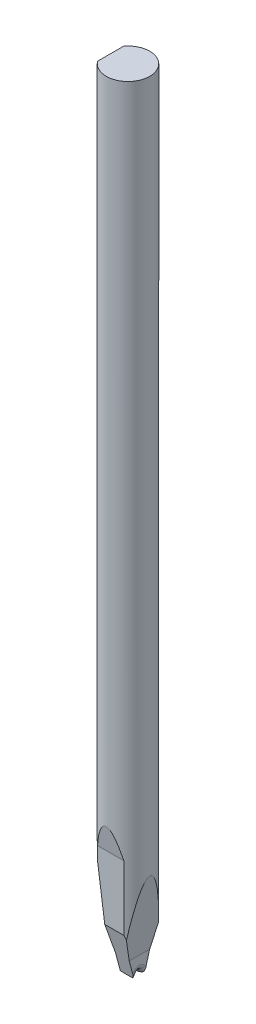
ISO-10303-21;
HEADER;
FILE_DESCRIPTION(('STEP AP214'),'2;1');
FILE_NAME('part.step','',(''),(''),'','','');
FILE_SCHEMA(('AUTOMOTIVE_DESIGN { 1 0 10303 214 1 1 1 1 }'));
ENDSEC;
DATA;
#1=APPLICATION_CONTEXT('core data for automotive mechanical design processes');
#2=APPLICATION_PROTOCOL_DEFINITION('international standard','automotive_design',2000,#1);
#3=PRODUCT_CONTEXT('',#1,'mechanical');
#4=PRODUCT('Part','Part','',(#3));
#5=PRODUCT_RELATED_PRODUCT_CATEGORY('part','',(#4));
#6=PRODUCT_DEFINITION_FORMATION('','',#4);
#7=PRODUCT_DEFINITION_CONTEXT('part definition',#1,'design');
#8=PRODUCT_DEFINITION('design','',#6,#7);
#9=PRODUCT_DEFINITION_SHAPE('','',#8);
#10=(LENGTH_UNIT() NAMED_UNIT(*) SI_UNIT(.MILLI.,.METRE.));
#11=(NAMED_UNIT(*) PLANE_ANGLE_UNIT() SI_UNIT($,.RADIAN.));
#12=(NAMED_UNIT(*) SI_UNIT($,.STERADIAN.) SOLID_ANGLE_UNIT());
#13=UNCERTAINTY_MEASURE_WITH_UNIT(LENGTH_MEASURE(1.E-05),#10,'distance_accuracy_value','');
#14=(GEOMETRIC_REPRESENTATION_CONTEXT(3) GLOBAL_UNCERTAINTY_ASSIGNED_CONTEXT((#13)) GLOBAL_UNIT_ASSIGNED_CONTEXT((#10,
#11,#12)) REPRESENTATION_CONTEXT('',''));
#15=CARTESIAN_POINT('',(0.,0.,0.));
#16=DIRECTION('',(0.,0.,1.));
#17=DIRECTION('',(1.,0.,0.));
#18=AXIS2_PLACEMENT_3D('',#15,#16,#17);
#19=CARTESIAN_POINT('',(0.,0.,0.));
#20=DIRECTION('',(0.,1.,0.));
#21=DIRECTION('',(0.,0.,1.));
#22=AXIS2_PLACEMENT_3D('',#19,#20,#21);
#23=PLANE('',#22);
#24=DIRECTION('',(-1.,0.,0.));
#25=VECTOR('',#24,1.);
#26=CARTESIAN_POINT('',(2.00770998,0.,-0.50038));
#27=LINE('',#26,#25);
#28=CARTESIAN_POINT('',(0.9359796221434,0.,-0.50038));
#29=VERTEX_POINT('',#28);
#30=CARTESIAN_POINT('',(-0.193625916812148,0.,-0.50038));
#31=VERTEX_POINT('',#30);
#32=EDGE_CURVE('E241',#29,#31,#27,.T.);
#33=ORIENTED_EDGE('',*,*,#32,.F.);
#34=CARTESIAN_POINT('',(0.54737,0.,-0.885190740972346));
#35=DIRECTION('',(0.,1.,0.));
#36=DIRECTION('',(0.,0.,-1.));
#37=AXIS2_PLACEMENT_3D('',#34,#35,#36);
#38=ELLIPSE('',#37,0.610851188724457,0.50038);
#39=CARTESIAN_POINT('',(0.54737,0.,-0.274339552247889));
#40=VERTEX_POINT('',#39);
#41=EDGE_CURVE('E413',#29,#40,#38,.F.);
#42=ORIENTED_EDGE('',*,*,#41,.T.);
#43=CARTESIAN_POINT('',(0.54737,0.,-0.274339552247889));
#44=DIRECTION('',(-1.,0.,0.));
#45=VECTOR('',#44,1.);
#46=LINE('',#43,#45);
#47=CARTESIAN_POINT('',(0.0469900000000003,0.,-0.274339552247889));
#48=VERTEX_POINT('',#47);
#49=EDGE_CURVE('E462',#40,#48,#46,.T.);
#50=ORIENTED_EDGE('',*,*,#49,.T.);
#51=CARTESIAN_POINT('',(0.0469900000000003,0.,-0.578214762882391));
#52=DIRECTION('',(0.,1.,0.));
#53=DIRECTION('',(0.,0.,1.));
#54=AXIS2_PLACEMENT_3D('',#51,#52,#53);
#55=ELLIPSE('',#54,0.303875210634501,0.24892);
#56=EDGE_CURVE('E416',#48,#31,#55,.F.);
#57=ORIENTED_EDGE('',*,*,#56,.T.);
#58=EDGE_LOOP('',(#33,#42,#50,#57));
#59=FACE_BOUND('',#58,.T.);
#60=ADVANCED_FACE('F41',(#59),#23,.F.);
#61=CARTESIAN_POINT('',(0.,71.99884,0.));
#62=DIRECTION('',(0.,-1.,0.));
#63=DIRECTION('',(0.,0.,-1.));
#64=AXIS2_PLACEMENT_3D('',#61,#62,#63);
#65=CYLINDRICAL_SURFACE('',#64,1.99771);
#66=CARTESIAN_POINT('',(0.,0.188793391958972,0.));
#67=DIRECTION('',(-0.99026806874157,-0.139173100960066,0.));
#68=DIRECTION('',(0.139173100960066,-0.99026806874157,0.));
#69=AXIS2_PLACEMENT_3D('',#66,#67,#68);
#70=ELLIPSE('',#69,14.3541387395918,1.99771);
#71=CARTESIAN_POINT('',(-1.20938746582723,8.79403234893694,1.59004));
#72=VERTEX_POINT('',#71);
#73=CARTESIAN_POINT('',(-1.60147,11.5838445412656,1.19421065277446));
#74=VERTEX_POINT('',#73);
#75=EDGE_CURVE('E251',#72,#74,#70,.T.);
#76=ORIENTED_EDGE('',*,*,#75,.F.);
#77=DIRECTION('',(0.,-1.,0.));
#78=VECTOR('',#77,1.);
#79=CARTESIAN_POINT('',(-1.20938746582723,71.99884,1.59004));
#80=LINE('',#79,#78);
#81=CARTESIAN_POINT('',(-1.20938746582723,9.98537787946442,1.59004));
#82=VERTEX_POINT('',#81);
#83=EDGE_CURVE('E213',#82,#72,#80,.T.);
#84=ORIENTED_EDGE('',*,*,#83,.F.);
#85=CARTESIAN_POINT('',(-1.20429720645774,10.0294845165918,1.5938988307349));
#86=CARTESIAN_POINT('',(-1.20598336450717,10.0222855201269,1.59262220181167));
#87=CARTESIAN_POINT('',(-1.20725063181282,10.0150104686973,1.59166231812201));
#88=CARTESIAN_POINT('',(-1.20894738488989,10.0003082563132,1.59037604124523));
#89=CARTESIAN_POINT('',(-1.2093768707074,9.99288109536695,1.59004964802325));
#90=CARTESIAN_POINT('',(-1.20938746582723,9.98537787946442,1.59004));
#91=B_SPLINE_CURVE_WITH_KNOTS('',3,(#85,#86,#87,#88,#89,#90),.UNSPECIFIED.,.F.,.F.,(4,2,4),(0.,
0.022340175644429,0.0446803500598758),.UNSPECIFIED.);
#92=CARTESIAN_POINT('',(-1.20429720645774,10.0294845165918,1.5938988307349));
#93=VERTEX_POINT('',#92);
#94=EDGE_CURVE('E305',#93,#82,#91,.T.);
#95=ORIENTED_EDGE('',*,*,#94,.F.);
#96=CARTESIAN_POINT('',(0.,0.990035055535105,0.));
#97=DIRECTION('',(0.,-0.173648177666931,0.984807753012208));
#98=DIRECTION('',(0.,-0.984807753012208,-0.173648177666931));
#99=AXIS2_PLACEMENT_3D('',#96,#97,#98);
#100=ELLIPSE('',#99,11.5043533818808,1.99771);
#101=CARTESIAN_POINT('',(1.20429720645774,10.0294845165918,1.5938988307349));
#102=VERTEX_POINT('',#101);
#103=EDGE_CURVE('E313',#102,#93,#100,.T.);
#104=ORIENTED_EDGE('',*,*,#103,.F.);
#105=CARTESIAN_POINT('',(1.20938746582723,9.98537787946442,1.59004));
#106=CARTESIAN_POINT('',(1.2093768707074,9.99288109536694,1.59004964802325));
#107=CARTESIAN_POINT('',(1.20894738488989,10.0003082563131,1.59037604124522));
#108=CARTESIAN_POINT('',(1.20725063181282,10.0150104686973,1.59166231812201));
#109=CARTESIAN_POINT('',(1.20598336450717,10.0222855201269,1.59262220181167));
#110=CARTESIAN_POINT('',(1.20429720645774,10.0294845165918,1.5938988307349));
#111=B_SPLINE_CURVE_WITH_KNOTS('',3,(#105,#106,#107,#108,#109,#110),.UNSPECIFIED.,.F.,.F.,(4,2,
4),(0.,0.0223401744154467,0.0446803500598775),.UNSPECIFIED.);
#112=CARTESIAN_POINT('',(1.20938746582723,9.98537787946442,1.59004));
#113=VERTEX_POINT('',#112);
#114=EDGE_CURVE('E274',#113,#102,#111,.T.);
#115=ORIENTED_EDGE('',*,*,#114,.F.);
#116=DIRECTION('',(0.,-1.,0.));
#117=VECTOR('',#116,1.);
#118=CARTESIAN_POINT('',(1.20938746582723,71.99884,1.59004));
#119=LINE('',#118,#117);
#120=CARTESIAN_POINT('',(1.20938746582723,4.06666648297549,1.59004));
#121=VERTEX_POINT('',#120);
#122=EDGE_CURVE('E270',#121,#113,#119,.F.);
#123=ORIENTED_EDGE('',*,*,#122,.F.);
#124=CARTESIAN_POINT('',(0.,-1.86744358309131,0.));
#125=DIRECTION('',(0.,-0.258819045102522,0.965925826289068));
#126=DIRECTION('',(0.,-0.965925826289068,-0.258819045102522));
#127=AXIS2_PLACEMENT_3D('',#124,#125,#126);
#128=ELLIPSE('',#127,7.71855872974372,1.99771);
#129=CARTESIAN_POINT('',(1.33590035902096,3.67589634007195,1.4853334557828));
#130=VERTEX_POINT('',#129);
#131=EDGE_CURVE('E202',#130,#121,#128,.T.);
#132=ORIENTED_EDGE('',*,*,#131,.F.);
#133=CARTESIAN_POINT('',(0.,-5.82952862662844,0.));
#134=DIRECTION('',(0.990268068741571,-0.139173100960058,0.));
#135=DIRECTION('',(-0.139173100960058,-0.990268068741571,0.));
#136=AXIS2_PLACEMENT_3D('',#133,#134,#135);
#137=ELLIPSE('',#136,14.3541387395926,1.99771);
#138=CARTESIAN_POINT('',(1.33590035902096,3.67589634007195,-1.4853334557828));
#139=VERTEX_POINT('',#138);
#140=EDGE_CURVE('E268',#139,#130,#137,.T.);
#141=ORIENTED_EDGE('',*,*,#140,.F.);
#142=CARTESIAN_POINT('',(0.,-1.86744358309131,0.));
#143=DIRECTION('',(0.,-0.258819045102522,-0.965925826289068));
#144=DIRECTION('',(0.,-0.965925826289068,0.258819045102522));
#145=AXIS2_PLACEMENT_3D('',#142,#143,#144);
#146=ELLIPSE('',#145,7.71855872974372,1.99771);
#147=CARTESIAN_POINT('',(1.20938746582723,4.06666648297549,-1.59004));
#148=VERTEX_POINT('',#147);
#149=EDGE_CURVE('E252',#148,#139,#146,.T.);
#150=ORIENTED_EDGE('',*,*,#149,.F.);
#151=DIRECTION('',(0.,-1.,0.));
#152=VECTOR('',#151,1.);
#153=CARTESIAN_POINT('',(1.20938746582723,71.99884,-1.59004));
#154=LINE('',#153,#152);
#155=CARTESIAN_POINT('',(1.20938746582723,9.98537787946442,-1.59004));
#156=VERTEX_POINT('',#155);
#157=EDGE_CURVE('E272',#156,#148,#154,.T.);
#158=ORIENTED_EDGE('',*,*,#157,.F.);
#159=CARTESIAN_POINT('',(1.20429720645774,10.0294845165918,-1.5938988307349));
#160=CARTESIAN_POINT('',(1.20598336450717,10.0222855201269,-1.59262220181167));
#161=CARTESIAN_POINT('',(1.20725063181282,10.0150104686973,-1.59166231812201));
#162=CARTESIAN_POINT('',(1.20894738488989,10.0003082563132,-1.59037604124523));
#163=CARTESIAN_POINT('',(1.2093768707074,9.99288109536695,-1.59004964802325));
#164=CARTESIAN_POINT('',(1.20938746582723,9.98537787946442,-1.59004));
#165=B_SPLINE_CURVE_WITH_KNOTS('',3,(#159,#160,#161,#162,#163,#164),.UNSPECIFIED.,.F.,.F.,(4,2,
4),(0.,0.022340175644429,0.0446803500598758),.UNSPECIFIED.);
#166=CARTESIAN_POINT('',(1.20429720645774,10.0294845165918,-1.5938988307349));
#167=VERTEX_POINT('',#166);
#168=EDGE_CURVE('E282',#167,#156,#165,.T.);
#169=ORIENTED_EDGE('',*,*,#168,.F.);
#170=CARTESIAN_POINT('',(0.,0.990035055535105,0.));
#171=DIRECTION('',(0.,-0.173648177666931,-0.984807753012208));
#172=DIRECTION('',(0.,-0.984807753012208,0.173648177666931));
#173=AXIS2_PLACEMENT_3D('',#170,#171,#172);
#174=ELLIPSE('',#173,11.5043533818808,1.99771);
#175=CARTESIAN_POINT('',(-1.20429720645774,10.0294845165918,-1.5938988307349));
#176=VERTEX_POINT('',#175);
#177=EDGE_CURVE('E528',#176,#167,#174,.T.);
#178=ORIENTED_EDGE('',*,*,#177,.F.);
#179=CARTESIAN_POINT('',(-1.20938746582723,9.98537787946442,-1.59004));
#180=CARTESIAN_POINT('',(-1.2093768707074,9.99288109536694,-1.59004964802325));
#181=CARTESIAN_POINT('',(-1.20894738488989,10.0003082563131,-1.59037604124522));
#182=CARTESIAN_POINT('',(-1.20725063181282,10.0150104686973,-1.59166231812201));
#183=CARTESIAN_POINT('',(-1.20598336450717,10.0222855201269,-1.59262220181167));
#184=CARTESIAN_POINT('',(-1.20429720645774,10.0294845165918,-1.5938988307349));
#185=B_SPLINE_CURVE_WITH_KNOTS('',3,(#179,#180,#181,#182,#183,#184),.UNSPECIFIED.,.F.,.F.,(4,2,
4),(0.,0.0223401744154467,0.0446803500598775),.UNSPECIFIED.);
#186=CARTESIAN_POINT('',(-1.20938746582723,9.98537787946442,-1.59004));
#187=VERTEX_POINT('',#186);
#188=EDGE_CURVE('E312',#187,#176,#185,.T.);
#189=ORIENTED_EDGE('',*,*,#188,.F.);
#190=DIRECTION('',(0.,-1.,0.));
#191=VECTOR('',#190,1.);
#192=CARTESIAN_POINT('',(-1.20938746582723,71.99884,-1.59004));
#193=LINE('',#192,#191);
#194=CARTESIAN_POINT('',(-1.20938746582723,8.79403234893694,-1.59004));
#195=VERTEX_POINT('',#194);
#196=EDGE_CURVE('E352',#195,#187,#193,.F.);
#197=ORIENTED_EDGE('',*,*,#196,.F.);
#198=CARTESIAN_POINT('',(-1.60147,11.5838445412656,-1.19421065277446));
#199=VERTEX_POINT('',#198);
#200=EDGE_CURVE('E205',#199,#195,#70,.T.);
#201=ORIENTED_EDGE('',*,*,#200,.F.);
#202=DIRECTION('',(0.,-1.,0.));
#203=VECTOR('',#202,1.);
#204=CARTESIAN_POINT('',(-1.60147,71.99884,-1.19421065277446));
#205=LINE('',#204,#203);
#206=CARTESIAN_POINT('',(-1.60147,71.99884,-1.19421065277446));
#207=VERTEX_POINT('',#206);
#208=EDGE_CURVE('E259',#207,#199,#205,.T.);
#209=ORIENTED_EDGE('',*,*,#208,.F.);
#210=CARTESIAN_POINT('',(0.,71.99884,0.));
#211=DIRECTION('',(0.,1.,0.));
#212=DIRECTION('',(0.,0.,1.));
#213=AXIS2_PLACEMENT_3D('',#210,#211,#212);
#214=CIRCLE('',#213,1.99771);
#215=CARTESIAN_POINT('',(-1.60147,71.99884,1.19421065277446));
#216=VERTEX_POINT('',#215);
#217=EDGE_CURVE('E262',#216,#207,#214,.T.);
#218=ORIENTED_EDGE('',*,*,#217,.F.);
#219=DIRECTION('',(0.,-1.,0.));
#220=VECTOR('',#219,1.);
#221=CARTESIAN_POINT('',(-1.60147,71.99884,1.19421065277446));
#222=LINE('',#221,#220);
#223=EDGE_CURVE('E257',#74,#216,#222,.F.);
#224=ORIENTED_EDGE('',*,*,#223,.F.);
#225=EDGE_LOOP('',(#76,#84,#95,#104,#115,#123,#132,#141,#150,#158,#169,#178,#189,#197,#201,#209,
#218,#224));
#226=FACE_BOUND('',#225,.T.);
#227=ADVANCED_FACE('F289',(#226),#65,.T.);
#228=CARTESIAN_POINT('',(-1.60147,71.99884,2.00770998));
#229=DIRECTION('',(-1.,0.,0.));
#230=DIRECTION('',(0.,0.,1.));
#231=AXIS2_PLACEMENT_3D('',#228,#229,#230);
#232=PLANE('',#231);
#233=ORIENTED_EDGE('',*,*,#208,.T.);
#234=DIRECTION('',(0.,0.,1.));
#235=VECTOR('',#234,1.);
#236=CARTESIAN_POINT('',(-1.60147,11.5838445412656,2.00770998));
#237=LINE('',#236,#235);
#238=EDGE_CURVE('E265',#199,#74,#237,.T.);
#239=ORIENTED_EDGE('',*,*,#238,.T.);
#240=ORIENTED_EDGE('',*,*,#223,.T.);
#241=DIRECTION('',(0.,0.,-1.));
#242=VECTOR('',#241,1.);
#243=CARTESIAN_POINT('',(-1.60147,71.99884,2.00770998));
#244=LINE('',#243,#242);
#245=EDGE_CURVE('E255',#216,#207,#244,.T.);
#246=ORIENTED_EDGE('',*,*,#245,.T.);
#247=EDGE_LOOP('',(#233,#239,#240,#246));
#248=FACE_BOUND('',#247,.T.);
#249=ADVANCED_FACE('F332',(#248),#232,.T.);
#250=CARTESIAN_POINT('',(0.,71.99884,0.));
#251=DIRECTION('',(0.,1.,0.));
#252=DIRECTION('',(0.,0.,1.));
#253=AXIS2_PLACEMENT_3D('',#250,#251,#252);
#254=PLANE('',#253);
#255=ORIENTED_EDGE('',*,*,#217,.T.);
#256=ORIENTED_EDGE('',*,*,#245,.F.);
#257=EDGE_LOOP('',(#255,#256));
#258=FACE_BOUND('',#257,.T.);
#259=ADVANCED_FACE('F335',(#258),#254,.T.);
#260=CARTESIAN_POINT('',(2.00770998,-0.00999998000000006,-1.59004));
#261=DIRECTION('',(0.,0.,-1.));
#262=DIRECTION('',(-1.,0.,0.));
#263=AXIS2_PLACEMENT_3D('',#260,#261,#262);
#264=PLANE('',#263);
#265=ORIENTED_EDGE('',*,*,#157,.T.);
#266=DIRECTION('',(-1.,0.,0.));
#267=VECTOR('',#266,1.);
#268=CARTESIAN_POINT('',(2.00770998,4.06666648297549,-1.59004));
#269=LINE('',#268,#267);
#270=CARTESIAN_POINT('',(-0.544999521081408,4.06666648297549,-1.59004));
#271=VERTEX_POINT('',#270);
#272=EDGE_CURVE('E243',#148,#271,#269,.T.);
#273=ORIENTED_EDGE('',*,*,#272,.T.);
#274=DIRECTION('',(-0.139173100960066,0.99026806874157,0.));
#275=VECTOR('',#274,1.);
#276=CARTESIAN_POINT('',(0.0662850795368128,-0.282849456023105,-1.59004));
#277=LINE('',#276,#275);
#278=EDGE_CURVE('E221',#271,#195,#277,.T.);
#279=ORIENTED_EDGE('',*,*,#278,.T.);
#280=ORIENTED_EDGE('',*,*,#196,.T.);
#281=DIRECTION('',(-1.,0.,0.));
#282=VECTOR('',#281,1.);
#283=CARTESIAN_POINT('',(2.00770998,9.98537787946442,-1.59004));
#284=LINE('',#283,#282);
#285=EDGE_CURVE('E245',#156,#187,#284,.T.);
#286=ORIENTED_EDGE('',*,*,#285,.F.);
#287=EDGE_LOOP('',(#265,#273,#279,#280,#286));
#288=FACE_BOUND('',#287,.T.);
#289=ADVANCED_FACE('F326',(#288),#264,.T.);
#290=CARTESIAN_POINT('',(2.00770998,-0.00999998000000006,1.59004));
#291=DIRECTION('',(0.,0.,1.));
#292=DIRECTION('',(1.,0.,0.));
#293=AXIS2_PLACEMENT_3D('',#290,#291,#292);
#294=PLANE('',#293);
#295=ORIENTED_EDGE('',*,*,#83,.T.);
#296=DIRECTION('',(0.139173100960066,-0.99026806874157,0.));
#297=VECTOR('',#296,1.);
#298=CARTESIAN_POINT('',(0.0662850795368128,-0.282849456023105,1.59004));
#299=LINE('',#298,#297);
#300=CARTESIAN_POINT('',(-0.544999521081408,4.06666648297549,1.59004));
#301=VERTEX_POINT('',#300);
#302=EDGE_CURVE('E209',#72,#301,#299,.T.);
#303=ORIENTED_EDGE('',*,*,#302,.T.);
#304=DIRECTION('',(-1.,0.,0.));
#305=VECTOR('',#304,1.);
#306=CARTESIAN_POINT('',(2.00770998,4.06666648297549,1.59004));
#307=LINE('',#306,#305);
#308=EDGE_CURVE('E193',#121,#301,#307,.T.);
#309=ORIENTED_EDGE('',*,*,#308,.F.);
#310=ORIENTED_EDGE('',*,*,#122,.T.);
#311=DIRECTION('',(-1.,0.,0.));
#312=VECTOR('',#311,1.);
#313=CARTESIAN_POINT('',(2.00770998,9.98537787946442,1.59004));
#314=LINE('',#313,#312);
#315=EDGE_CURVE('E234',#113,#82,#314,.T.);
#316=ORIENTED_EDGE('',*,*,#315,.T.);
#317=EDGE_LOOP('',(#295,#303,#309,#310,#316));
#318=FACE_BOUND('',#317,.T.);
#319=ADVANCED_FACE('F210',(#318),#294,.T.);
#320=CARTESIAN_POINT('',(2.00770998,10.0294845165918,-1.5938988307349));
#321=DIRECTION('',(0.,-0.173648177666931,-0.984807753012208));
#322=DIRECTION('',(0.,0.984807753012208,-0.173648177666931));
#323=AXIS2_PLACEMENT_3D('',#320,#321,#322);
#324=PLANE('',#323);
#325=ORIENTED_EDGE('',*,*,#177,.T.);
#326=DIRECTION('',(-1.,0.,0.));
#327=VECTOR('',#326,1.);
#328=CARTESIAN_POINT('',(2.00770998,10.0294845165918,-1.5938988307349));
#329=LINE('',#328,#327);
#330=EDGE_CURVE('E206',#167,#176,#329,.T.);
#331=ORIENTED_EDGE('',*,*,#330,.T.);
#332=EDGE_LOOP('',(#325,#331));
#333=FACE_BOUND('',#332,.T.);
#334=ADVANCED_FACE('F324',(#333),#324,.T.);
#335=CARTESIAN_POINT('',(2.00770998,9.98537787946442,-1.84404));
#336=DIRECTION('',(-1.,0.,0.));
#337=DIRECTION('',(0.,0.,1.));
#338=AXIS2_PLACEMENT_3D('',#335,#336,#337);
#339=CYLINDRICAL_SURFACE('',#338,0.254);
#340=ORIENTED_EDGE('',*,*,#168,.T.);
#341=ORIENTED_EDGE('',*,*,#285,.T.);
#342=ORIENTED_EDGE('',*,*,#188,.T.);
#343=ORIENTED_EDGE('',*,*,#330,.F.);
#344=EDGE_LOOP('',(#340,#341,#342,#343));
#345=FACE_BOUND('',#344,.T.);
#346=ADVANCED_FACE('F299',(#345),#339,.F.);
#347=CARTESIAN_POINT('',(2.00770998,9.98537787946442,1.84404));
#348=DIRECTION('',(-1.,0.,0.));
#349=DIRECTION('',(0.,0.,1.));
#350=AXIS2_PLACEMENT_3D('',#347,#348,#349);
#351=CYLINDRICAL_SURFACE('',#350,0.254);
#352=ORIENTED_EDGE('',*,*,#114,.T.);
#353=DIRECTION('',(-1.,0.,0.));
#354=VECTOR('',#353,1.);
#355=CARTESIAN_POINT('',(2.00770998,10.0294845165918,1.5938988307349));
#356=LINE('',#355,#354);
#357=EDGE_CURVE('E236',#102,#93,#356,.T.);
#358=ORIENTED_EDGE('',*,*,#357,.T.);
#359=ORIENTED_EDGE('',*,*,#94,.T.);
#360=ORIENTED_EDGE('',*,*,#315,.F.);
#361=EDGE_LOOP('',(#352,#358,#359,#360));
#362=FACE_BOUND('',#361,.T.);
#363=ADVANCED_FACE('F293',(#362),#351,.F.);
#364=CARTESIAN_POINT('',(2.00770998,10.0294845165918,1.5938988307349));
#365=DIRECTION('',(0.,-0.173648177666931,0.984807753012208));
#366=DIRECTION('',(0.,-0.984807753012208,-0.173648177666931));
#367=AXIS2_PLACEMENT_3D('',#364,#365,#366);
#368=PLANE('',#367);
#369=ORIENTED_EDGE('',*,*,#103,.T.);
#370=ORIENTED_EDGE('',*,*,#357,.F.);
#371=EDGE_LOOP('',(#369,#370));
#372=FACE_BOUND('',#371,.T.);
#373=ADVANCED_FACE('F298',(#372),#368,.T.);
#374=CARTESIAN_POINT('',(1.04775,1.6256,2.00770998));
#375=DIRECTION('',(0.990268068741571,-0.139173100960058,0.));
#376=DIRECTION('',(0.139173100960058,0.990268068741571,0.));
#377=AXIS2_PLACEMENT_3D('',#374,#375,#376);
#378=PLANE('',#377);
#379=ORIENTED_EDGE('',*,*,#140,.T.);
#380=DIRECTION('',(0.13451818867903,0.957146646836786,0.256466671058075));
#381=VECTOR('',#380,1.);
#382=CARTESIAN_POINT('',(0.840791506250256,0.15301379978275,0.541379924082605));
#383=LINE('',#382,#381);
#384=CARTESIAN_POINT('',(1.04775,1.6256,0.935958207216034));
#385=VERTEX_POINT('',#384);
#386=EDGE_CURVE('E485',#385,#130,#383,.T.);
#387=ORIENTED_EDGE('',*,*,#386,.F.);
#388=DIRECTION('',(0.,0.,-1.));
#389=VECTOR('',#388,1.);
#390=CARTESIAN_POINT('',(1.04775,1.6256,2.00770998));
#391=LINE('',#390,#389);
#392=CARTESIAN_POINT('',(1.04775,1.6256,-0.935958207216034));
#393=VERTEX_POINT('',#392);
#394=EDGE_CURVE('E480',#385,#393,#391,.T.);
#395=ORIENTED_EDGE('',*,*,#394,.T.);
#396=DIRECTION('',(-0.13451818867903,-0.957146646836786,0.256466671058075));
#397=VECTOR('',#396,1.);
#398=CARTESIAN_POINT('',(0.840791506250256,0.15301379978275,-0.541379924082605));
#399=LINE('',#398,#397);
#400=EDGE_CURVE('E478',#139,#393,#399,.T.);
#401=ORIENTED_EDGE('',*,*,#400,.F.);
#402=EDGE_LOOP('',(#379,#387,#395,#401));
#403=FACE_BOUND('',#402,.T.);
#404=ADVANCED_FACE('F390',(#403),#378,.T.);
#405=CARTESIAN_POINT('',(2.00770998,0.,0.50038));
#406=DIRECTION('',(0.,-0.258819045102522,0.965925826289068));
#407=DIRECTION('',(0.,-0.965925826289068,-0.258819045102522));
#408=AXIS2_PLACEMENT_3D('',#405,#406,#407);
#409=PLANE('',#408);
#410=DIRECTION('',(-1.,0.,0.));
#411=VECTOR('',#410,1.);
#412=CARTESIAN_POINT('',(2.00770998,0.,0.50038));
#413=LINE('',#412,#411);
#414=CARTESIAN_POINT('',(0.9359796221434,0.,0.50038));
#415=VERTEX_POINT('',#414);
#416=CARTESIAN_POINT('',(-0.193625916812148,0.,0.50038));
#417=VERTEX_POINT('',#416);
#418=EDGE_CURVE('E239',#415,#417,#413,.T.);
#419=ORIENTED_EDGE('',*,*,#418,.F.);
#420=CARTESIAN_POINT('',(0.54737,0.397467402532683,0.606881069526329));
#421=DIRECTION('',(0.,-0.258819045102522,0.965925826289068));
#422=DIRECTION('',(0.,0.965925826289068,0.258819045102522));
#423=AXIS2_PLACEMENT_3D('',#420,#421,#422);
#424=ELLIPSE('',#423,0.653199699436086,0.50038);
#425=CARTESIAN_POINT('',(1.04775,0.397467402532683,0.606881069526329));
#426=VERTEX_POINT('',#425);
#427=EDGE_CURVE('E50',#415,#426,#424,.T.);
#428=ORIENTED_EDGE('',*,*,#427,.T.);
#429=DIRECTION('',(0.,0.965925826289068,0.258819045102522));
#430=VECTOR('',#429,1.);
#431=CARTESIAN_POINT('',(1.04775,0.,0.50038));
#432=LINE('',#431,#430);
#433=EDGE_CURVE('E479',#426,#385,#432,.T.);
#434=ORIENTED_EDGE('',*,*,#433,.T.);
#435=ORIENTED_EDGE('',*,*,#386,.T.);
#436=ORIENTED_EDGE('',*,*,#131,.T.);
#437=ORIENTED_EDGE('',*,*,#308,.T.);
#438=DIRECTION('',(0.134518188679037,-0.957146646836785,-0.256466671058074));
#439=VECTOR('',#438,1.);
#440=CARTESIAN_POINT('',(0.062382858549715,-0.255083710961456,0.432030525645544));
#441=LINE('',#440,#439);
#442=CARTESIAN_POINT('',(-0.20193,1.6256,0.935958207216034));
#443=VERTEX_POINT('',#442);
#444=EDGE_CURVE('E198',#301,#443,#441,.T.);
#445=ORIENTED_EDGE('',*,*,#444,.T.);
#446=DIRECTION('',(0.,-0.965925826289068,-0.258819045102522));
#447=VECTOR('',#446,1.);
#448=CARTESIAN_POINT('',(-0.20193,0.,0.50038));
#449=LINE('',#448,#447);
#450=CARTESIAN_POINT('',(-0.20193,0.0803947960273653,0.521921720671197));
#451=VERTEX_POINT('',#450);
#452=EDGE_CURVE('E232',#443,#451,#449,.T.);
#453=ORIENTED_EDGE('',*,*,#452,.T.);
#454=CARTESIAN_POINT('',(0.0469900000000002,0.0803947960273652,0.521921720671197));
#455=DIRECTION('',(0.,-0.258819045102522,0.965925826289068));
#456=DIRECTION('',(0.,-0.965925826289068,-0.258819045102522));
#457=AXIS2_PLACEMENT_3D('',#454,#455,#456);
#458=ELLIPSE('',#457,0.324941982460591,0.24892);
#459=EDGE_CURVE('E491',#451,#417,#458,.T.);
#460=ORIENTED_EDGE('',*,*,#459,.T.);
#461=EDGE_LOOP('',(#419,#428,#434,#435,#436,#437,#445,#453,#460));
#462=FACE_BOUND('',#461,.T.);
#463=ADVANCED_FACE('F195',(#462),#409,.T.);
#464=CARTESIAN_POINT('',(2.00770998,0.,-0.50038));
#465=DIRECTION('',(0.,-0.258819045102522,-0.965925826289068));
#466=DIRECTION('',(0.,0.965925826289068,-0.258819045102522));
#467=AXIS2_PLACEMENT_3D('',#464,#465,#466);
#468=PLANE('',#467);
#469=DIRECTION('',(0.,-0.965925826289068,0.258819045102522));
#470=VECTOR('',#469,1.);
#471=CARTESIAN_POINT('',(1.04775,0.,-0.50038));
#472=LINE('',#471,#470);
#473=CARTESIAN_POINT('',(1.04775,0.397467402532684,-0.606881069526329));
#474=VERTEX_POINT('',#473);
#475=EDGE_CURVE('E475',#393,#474,#472,.T.);
#476=ORIENTED_EDGE('',*,*,#475,.T.);
#477=CARTESIAN_POINT('',(0.54737,0.397467402532683,-0.606881069526329));
#478=DIRECTION('',(0.,-0.258819045102522,-0.965925826289068));
#479=DIRECTION('',(0.,-0.965925826289068,0.258819045102522));
#480=AXIS2_PLACEMENT_3D('',#477,#478,#479);
#481=ELLIPSE('',#480,0.653199699436086,0.50038);
#482=EDGE_CURVE('E424',#474,#29,#481,.T.);
#483=ORIENTED_EDGE('',*,*,#482,.T.);
#484=ORIENTED_EDGE('',*,*,#32,.T.);
#485=CARTESIAN_POINT('',(0.0469900000000003,0.0803947960273654,-0.521921720671197));
#486=DIRECTION('',(0.,-0.258819045102522,-0.965925826289068));
#487=DIRECTION('',(0.,0.965925826289068,-0.258819045102522));
#488=AXIS2_PLACEMENT_3D('',#485,#486,#487);
#489=ELLIPSE('',#488,0.324941982460591,0.24892);
#490=CARTESIAN_POINT('',(-0.20193,0.0803947960273654,-0.521921720671197));
#491=VERTEX_POINT('',#490);
#492=EDGE_CURVE('E458',#31,#491,#489,.T.);
#493=ORIENTED_EDGE('',*,*,#492,.T.);
#494=DIRECTION('',(0.,0.965925826289068,-0.258819045102522));
#495=VECTOR('',#494,1.);
#496=CARTESIAN_POINT('',(-0.20193,0.,-0.50038));
#497=LINE('',#496,#495);
#498=CARTESIAN_POINT('',(-0.20193,1.6256,-0.935958207216034));
#499=VERTEX_POINT('',#498);
#500=EDGE_CURVE('E230',#491,#499,#497,.T.);
#501=ORIENTED_EDGE('',*,*,#500,.T.);
#502=DIRECTION('',(-0.134518188679037,0.957146646836785,-0.256466671058074));
#503=VECTOR('',#502,1.);
#504=CARTESIAN_POINT('',(0.062382858549715,-0.255083710961456,-0.432030525645544));
#505=LINE('',#504,#503);
#506=EDGE_CURVE('E224',#499,#271,#505,.T.);
#507=ORIENTED_EDGE('',*,*,#506,.T.);
#508=ORIENTED_EDGE('',*,*,#272,.F.);
#509=ORIENTED_EDGE('',*,*,#149,.T.);
#510=ORIENTED_EDGE('',*,*,#400,.T.);
#511=EDGE_LOOP('',(#476,#483,#484,#493,#501,#507,#508,#509,#510));
#512=FACE_BOUND('',#511,.T.);
#513=ADVANCED_FACE('F399',(#512),#468,.T.);
#514=CARTESIAN_POINT('',(-0.20193,1.6256,2.00770998));
#515=DIRECTION('',(-0.99026806874157,-0.139173100960066,0.));
#516=DIRECTION('',(0.139173100960066,-0.99026806874157,0.));
#517=AXIS2_PLACEMENT_3D('',#514,#515,#516);
#518=PLANE('',#517);
#519=ORIENTED_EDGE('',*,*,#75,.T.);
#520=ORIENTED_EDGE('',*,*,#238,.F.);
#521=ORIENTED_EDGE('',*,*,#200,.T.);
#522=ORIENTED_EDGE('',*,*,#278,.F.);
#523=ORIENTED_EDGE('',*,*,#506,.F.);
#524=DIRECTION('',(0.,0.,-1.));
#525=VECTOR('',#524,1.);
#526=CARTESIAN_POINT('',(-0.20193,1.6256,2.00770998));
#527=LINE('',#526,#525);
#528=EDGE_CURVE('E216',#443,#499,#527,.T.);
#529=ORIENTED_EDGE('',*,*,#528,.F.);
#530=ORIENTED_EDGE('',*,*,#444,.F.);
#531=ORIENTED_EDGE('',*,*,#302,.F.);
#532=EDGE_LOOP('',(#519,#520,#521,#522,#523,#529,#530,#531));
#533=FACE_BOUND('',#532,.T.);
#534=ADVANCED_FACE('F218',(#533),#518,.T.);
#535=CARTESIAN_POINT('',(-0.20193,1.61560002,2.00770998));
#536=DIRECTION('',(-1.,0.,0.));
#537=DIRECTION('',(0.,-1.,0.));
#538=AXIS2_PLACEMENT_3D('',#535,#536,#537);
#539=PLANE('',#538);
#540=CARTESIAN_POINT('',(-0.20193,0.22352,0.));
#541=DIRECTION('',(-1.,0.,0.));
#542=DIRECTION('',(0.,-1.,0.));
#543=AXIS2_PLACEMENT_3D('',#540,#541,#542);
#544=CIRCLE('',#543,0.34544);
#545=CARTESIAN_POINT('',(-0.20193,0.421656244173105,-0.28296788217919));
#546=VERTEX_POINT('',#545);
#547=CARTESIAN_POINT('',(-0.20193,0.421656244173105,0.28296788217919));
#548=VERTEX_POINT('',#547);
#549=EDGE_CURVE('E498',#546,#548,#544,.F.);
#550=ORIENTED_EDGE('',*,*,#549,.T.);
#551=DIRECTION('',(0.,0.819152044288993,-0.573576436351045));
#552=VECTOR('',#551,1.);
#553=CARTESIAN_POINT('',(-0.20193,0.142774646536502,0.478242879112305));
#554=LINE('',#553,#552);
#555=EDGE_CURVE('E488',#548,#451,#554,.F.);
#556=ORIENTED_EDGE('',*,*,#555,.T.);
#557=ORIENTED_EDGE('',*,*,#452,.F.);
#558=ORIENTED_EDGE('',*,*,#528,.T.);
#559=ORIENTED_EDGE('',*,*,#500,.F.);
#560=DIRECTION('',(0.,-0.819152044288993,-0.573576436351045));
#561=VECTOR('',#560,1.);
#562=CARTESIAN_POINT('',(-0.20193,0.421656244173104,-0.28296788217919));
#563=LINE('',#562,#561);
#564=EDGE_CURVE('E514',#491,#546,#563,.F.);
#565=ORIENTED_EDGE('',*,*,#564,.T.);
#566=EDGE_LOOP('',(#550,#556,#557,#558,#559,#565));
#567=FACE_BOUND('',#566,.T.);
#568=ADVANCED_FACE('F396',(#567),#539,.T.);
#569=CARTESIAN_POINT('',(1.04775,-0.00999998,2.00770998));
#570=DIRECTION('',(1.,0.,0.));
#571=DIRECTION('',(0.,0.,-1.));
#572=AXIS2_PLACEMENT_3D('',#569,#570,#571);
#573=PLANE('',#572);
#574=CARTESIAN_POINT('',(1.04775,0.22352,0.));
#575=DIRECTION('',(1.,0.,0.));
#576=DIRECTION('',(0.,0.,-1.));
#577=AXIS2_PLACEMENT_3D('',#574,#575,#576);
#578=CIRCLE('',#577,0.5969);
#579=CARTESIAN_POINT('',(1.04775,0.565887774857938,0.4889518552361));
#580=VERTEX_POINT('',#579);
#581=CARTESIAN_POINT('',(1.04775,0.565887774857938,-0.4889518552361));
#582=VERTEX_POINT('',#581);
#583=EDGE_CURVE('E467',#580,#582,#578,.F.);
#584=ORIENTED_EDGE('',*,*,#583,.T.);
#585=DIRECTION('',(0.,0.819152044288993,0.573576436351045));
#586=VECTOR('',#585,1.);
#587=CARTESIAN_POINT('',(1.04775,0.287006177221336,-0.684226852169215));
#588=LINE('',#587,#586);
#589=EDGE_CURVE('E430',#582,#474,#588,.F.);
#590=ORIENTED_EDGE('',*,*,#589,.T.);
#591=ORIENTED_EDGE('',*,*,#475,.F.);
#592=ORIENTED_EDGE('',*,*,#394,.F.);
#593=ORIENTED_EDGE('',*,*,#433,.F.);
#594=DIRECTION('',(0.,-0.819152044288993,0.573576436351045));
#595=VECTOR('',#594,1.);
#596=CARTESIAN_POINT('',(1.04775,0.565887774857939,0.488951855236099));
#597=LINE('',#596,#595);
#598=EDGE_CURVE('E471',#426,#580,#597,.F.);
#599=ORIENTED_EDGE('',*,*,#598,.T.);
#600=EDGE_LOOP('',(#584,#590,#591,#592,#593,#599));
#601=FACE_BOUND('',#600,.T.);
#602=ADVANCED_FACE('F343',(#601),#573,.T.);
#603=CARTESIAN_POINT('',(0.0469900000000003,0.,0.274339552247889));
#604=DIRECTION('',(1.,0.,0.));
#605=VECTOR('',#604,1.);
#606=LINE('',#603,#605);
#607=CARTESIAN_POINT('',(0.0469900000000002,0.,0.274339552247889));
#608=VERTEX_POINT('',#607);
#609=CARTESIAN_POINT('',(0.54737,0.,0.274339552247889));
#610=VERTEX_POINT('',#609);
#611=EDGE_CURVE('E360',#608,#610,#606,.T.);
#612=ORIENTED_EDGE('',*,*,#611,.T.);
#613=CARTESIAN_POINT('',(0.54737,0.,0.885190740972346));
#614=DIRECTION('',(0.,1.,0.));
#615=DIRECTION('',(0.,0.,-1.));
#616=AXIS2_PLACEMENT_3D('',#613,#614,#615);
#617=ELLIPSE('',#616,0.610851188724456,0.50038);
#618=EDGE_CURVE('E58',#610,#415,#617,.F.);
#619=ORIENTED_EDGE('',*,*,#618,.T.);
#620=ORIENTED_EDGE('',*,*,#418,.T.);
#621=CARTESIAN_POINT('',(0.0469900000000002,0.,0.57821476288239));
#622=DIRECTION('',(0.,1.,0.));
#623=DIRECTION('',(0.,0.,1.));
#624=AXIS2_PLACEMENT_3D('',#621,#622,#623);
#625=ELLIPSE('',#624,0.303875210634501,0.24892);
#626=EDGE_CURVE('E494',#417,#608,#625,.F.);
#627=ORIENTED_EDGE('',*,*,#626,.T.);
#628=EDGE_LOOP('',(#612,#619,#620,#627));
#629=FACE_BOUND('',#628,.T.);
#630=ADVANCED_FACE('F339',(#629),#23,.F.);
#631=CARTESIAN_POINT('',(-1.60147,0.278881597636603,-0.0790645553147735));
#632=DIRECTION('',(0.,0.573576436351045,-0.819152044288993));
#633=DIRECTION('',(0.,0.819152044288993,0.573576436351045));
#634=AXIS2_PLACEMENT_3D('',#631,#632,#633);
#635=PLANE('',#634);
#636=ORIENTED_EDGE('',*,*,#49,.F.);
#637=DIRECTION('',(0.,0.819152044288993,0.573576436351045));
#638=VECTOR('',#637,1.);
#639=CARTESIAN_POINT('',(0.54737,0.278881597636603,-0.0790645553147736));
#640=LINE('',#639,#638);
#641=CARTESIAN_POINT('',(0.54737,0.278881597636603,-0.0790645553147735));
#642=VERTEX_POINT('',#641);
#643=EDGE_CURVE('E426',#40,#642,#640,.T.);
#644=ORIENTED_EDGE('',*,*,#643,.T.);
#645=DIRECTION('',(1.,0.,0.));
#646=VECTOR('',#645,1.);
#647=CARTESIAN_POINT('',(-1.60147,0.278881597636603,-0.0790645553147735));
#648=LINE('',#647,#646);
#649=CARTESIAN_POINT('',(0.0469900000000002,0.278881597636603,-0.0790645553147735));
#650=VERTEX_POINT('',#649);
#651=EDGE_CURVE('E455',#650,#642,#648,.T.);
#652=ORIENTED_EDGE('',*,*,#651,.F.);
#653=DIRECTION('',(0.,-0.819152044288993,-0.573576436351045));
#654=VECTOR('',#653,1.);
#655=CARTESIAN_POINT('',(0.0469900000000003,0.,-0.274339552247889));
#656=LINE('',#655,#654);
#657=EDGE_CURVE('E505',#650,#48,#656,.T.);
#658=ORIENTED_EDGE('',*,*,#657,.T.);
#659=EDGE_LOOP('',(#636,#644,#652,#658));
#660=FACE_BOUND('',#659,.T.);
#661=ADVANCED_FACE('F342',(#660),#635,.F.);
#662=CARTESIAN_POINT('',(-1.60147,-0.00999998000000014,0.281341613625836));
#663=DIRECTION('',(0.,0.573576436351044,0.819152044288993));
#664=DIRECTION('',(0.,-0.819152044288993,0.573576436351045));
#665=AXIS2_PLACEMENT_3D('',#662,#663,#664);
#666=PLANE('',#665);
#667=DIRECTION('',(1.,0.,0.));
#668=VECTOR('',#667,1.);
#669=CARTESIAN_POINT('',(-1.60147,0.278881597636603,0.0790645553147736));
#670=LINE('',#669,#668);
#671=CARTESIAN_POINT('',(0.0469900000000002,0.278881597636603,0.0790645553147736));
#672=VERTEX_POINT('',#671);
#673=CARTESIAN_POINT('',(0.54737,0.278881597636603,0.0790645553147736));
#674=VERTEX_POINT('',#673);
#675=EDGE_CURVE('E373',#672,#674,#670,.T.);
#676=ORIENTED_EDGE('',*,*,#675,.T.);
#677=DIRECTION('',(0.,-0.819152044288993,0.573576436351045));
#678=VECTOR('',#677,1.);
#679=CARTESIAN_POINT('',(0.54737,0.,0.274339552247889));
#680=LINE('',#679,#678);
#681=EDGE_CURVE('E427',#674,#610,#680,.T.);
#682=ORIENTED_EDGE('',*,*,#681,.T.);
#683=ORIENTED_EDGE('',*,*,#611,.F.);
#684=DIRECTION('',(0.,0.819152044288993,-0.573576436351045));
#685=VECTOR('',#684,1.);
#686=CARTESIAN_POINT('',(0.0469900000000002,0.278881597636603,0.0790645553147733));
#687=LINE('',#686,#685);
#688=EDGE_CURVE('E366',#608,#672,#687,.T.);
#689=ORIENTED_EDGE('',*,*,#688,.T.);
#690=EDGE_LOOP('',(#676,#682,#683,#689));
#691=FACE_BOUND('',#690,.T.);
#692=ADVANCED_FACE('F379',(#691),#666,.F.);
#693=CARTESIAN_POINT('',(-1.60147,0.22352,0.));
#694=DIRECTION('',(1.,0.,0.));
#695=DIRECTION('',(0.,0.,-1.));
#696=AXIS2_PLACEMENT_3D('',#693,#694,#695);
#697=CYLINDRICAL_SURFACE('',#696,0.0965199999999999);
#698=ORIENTED_EDGE('',*,*,#651,.T.);
#699=CARTESIAN_POINT('',(0.54737,0.22352,0.));
#700=DIRECTION('',(1.,0.,0.));
#701=DIRECTION('',(0.,0.,-1.));
#702=AXIS2_PLACEMENT_3D('',#699,#700,#701);
#703=CIRCLE('',#702,0.0965199999999999);
#704=EDGE_CURVE('E11',#642,#674,#703,.T.);
#705=ORIENTED_EDGE('',*,*,#704,.T.);
#706=ORIENTED_EDGE('',*,*,#675,.F.);
#707=CARTESIAN_POINT('',(0.0469900000000002,0.22352,0.));
#708=DIRECTION('',(-1.,0.,0.));
#709=DIRECTION('',(0.,-1.,0.));
#710=AXIS2_PLACEMENT_3D('',#707,#708,#709);
#711=CIRCLE('',#710,0.0965199999999999);
#712=EDGE_CURVE('E496',#672,#650,#711,.T.);
#713=ORIENTED_EDGE('',*,*,#712,.T.);
#714=EDGE_LOOP('',(#698,#705,#706,#713));
#715=FACE_BOUND('',#714,.T.);
#716=ADVANCED_FACE('F389',(#715),#697,.F.);
#717=CARTESIAN_POINT('',(0.0469900000000002,0.421656244173105,-0.282967882179189));
#718=DIRECTION('',(0.,0.819152044288993,0.573576436351045));
#719=DIRECTION('',(0.,-0.573576436351045,0.819152044288993));
#720=AXIS2_PLACEMENT_3D('',#717,#718,#719);
#721=CYLINDRICAL_SURFACE('',#720,0.24892);
#722=ORIENTED_EDGE('',*,*,#56,.F.);
#723=ORIENTED_EDGE('',*,*,#657,.F.);
#724=CARTESIAN_POINT('',(0.0469900000000001,0.421656244173105,-0.28296788217919));
#725=DIRECTION('',(0.,0.819152044288993,0.573576436351044));
#726=DIRECTION('',(0.,-0.573576436351044,0.819152044288993));
#727=AXIS2_PLACEMENT_3D('',#724,#725,#726);
#728=CIRCLE('',#727,0.24892);
#729=EDGE_CURVE('E448',#546,#650,#728,.T.);
#730=ORIENTED_EDGE('',*,*,#729,.F.);
#731=ORIENTED_EDGE('',*,*,#564,.F.);
#732=ORIENTED_EDGE('',*,*,#492,.F.);
#733=EDGE_LOOP('',(#722,#723,#730,#731,#732));
#734=FACE_BOUND('',#733,.T.);
#735=ADVANCED_FACE('F511',(#734),#721,.T.);
#736=CARTESIAN_POINT('',(0.0469900000000002,0.22352,0.));
#737=DIRECTION('',(-1.,0.,0.));
#738=DIRECTION('',(0.,-1.,0.));
#739=AXIS2_PLACEMENT_3D('',#736,#737,#738);
#740=TOROIDAL_SURFACE('',#739,0.34544,0.24892);
#741=ORIENTED_EDGE('',*,*,#729,.T.);
#742=ORIENTED_EDGE('',*,*,#712,.F.);
#743=CARTESIAN_POINT('',(0.0469900000000001,0.421656244173105,0.28296788217919));
#744=DIRECTION('',(0.,-0.819152044288993,0.573576436351044));
#745=DIRECTION('',(0.,-0.573576436351045,-0.819152044288993));
#746=AXIS2_PLACEMENT_3D('',#743,#744,#745);
#747=CIRCLE('',#746,0.24892);
#748=EDGE_CURVE('E444',#548,#672,#747,.T.);
#749=ORIENTED_EDGE('',*,*,#748,.F.);
#750=ORIENTED_EDGE('',*,*,#549,.F.);
#751=EDGE_LOOP('',(#741,#742,#749,#750));
#752=FACE_BOUND('',#751,.T.);
#753=ADVANCED_FACE('F551',(#752),#740,.T.);
#754=CARTESIAN_POINT('',(0.0469900000000002,0.132774666536502,0.485244940490251));
#755=DIRECTION('',(0.,-0.819152044288993,0.573576436351045));
#756=DIRECTION('',(0.,-0.573576436351045,-0.819152044288993));
#757=AXIS2_PLACEMENT_3D('',#754,#755,#756);
#758=CYLINDRICAL_SURFACE('',#757,0.24892);
#759=ORIENTED_EDGE('',*,*,#459,.F.);
#760=ORIENTED_EDGE('',*,*,#555,.F.);
#761=ORIENTED_EDGE('',*,*,#748,.T.);
#762=ORIENTED_EDGE('',*,*,#688,.F.);
#763=ORIENTED_EDGE('',*,*,#626,.F.);
#764=EDGE_LOOP('',(#759,#760,#761,#762,#763));
#765=FACE_BOUND('',#764,.T.);
#766=ADVANCED_FACE('F493',(#765),#758,.T.);
#767=CARTESIAN_POINT('',(0.54737,0.277006197221335,0.691228913547162));
#768=DIRECTION('',(0.,0.819152044288993,-0.573576436351045));
#769=DIRECTION('',(0.,0.573576436351045,0.819152044288993));
#770=AXIS2_PLACEMENT_3D('',#767,#768,#769);
#771=CYLINDRICAL_SURFACE('',#770,0.50038);
#772=ORIENTED_EDGE('',*,*,#618,.F.);
#773=ORIENTED_EDGE('',*,*,#681,.F.);
#774=CARTESIAN_POINT('',(0.54737,0.565887774857938,0.4889518552361));
#775=DIRECTION('',(0.,0.819152044288993,-0.573576436351045));
#776=DIRECTION('',(0.,0.573576436351045,0.819152044288993));
#777=AXIS2_PLACEMENT_3D('',#774,#775,#776);
#778=CIRCLE('',#777,0.50038);
#779=EDGE_CURVE('E45',#580,#674,#778,.T.);
#780=ORIENTED_EDGE('',*,*,#779,.F.);
#781=ORIENTED_EDGE('',*,*,#598,.F.);
#782=ORIENTED_EDGE('',*,*,#427,.F.);
#783=EDGE_LOOP('',(#772,#773,#780,#781,#782));
#784=FACE_BOUND('',#783,.T.);
#785=ADVANCED_FACE('F43',(#784),#771,.T.);
#786=CARTESIAN_POINT('',(0.54737,0.22352,0.));
#787=DIRECTION('',(1.,0.,0.));
#788=DIRECTION('',(0.,0.,-1.));
#789=AXIS2_PLACEMENT_3D('',#786,#787,#788);
#790=TOROIDAL_SURFACE('',#789,0.5969,0.50038);
#791=ORIENTED_EDGE('',*,*,#779,.T.);
#792=ORIENTED_EDGE('',*,*,#704,.F.);
#793=CARTESIAN_POINT('',(0.54737,0.565887774857938,-0.4889518552361));
#794=DIRECTION('',(0.,-0.819152044288993,-0.573576436351045));
#795=DIRECTION('',(0.,0.573576436351045,-0.819152044288993));
#796=AXIS2_PLACEMENT_3D('',#793,#794,#795);
#797=CIRCLE('',#796,0.50038);
#798=EDGE_CURVE('E441',#582,#642,#797,.T.);
#799=ORIENTED_EDGE('',*,*,#798,.F.);
#800=ORIENTED_EDGE('',*,*,#583,.F.);
#801=EDGE_LOOP('',(#791,#792,#799,#800));
#802=FACE_BOUND('',#801,.T.);
#803=ADVANCED_FACE('F548',(#802),#790,.T.);
#804=CARTESIAN_POINT('',(0.54737,0.565887774857938,-0.4889518552361));
#805=DIRECTION('',(0.,-0.819152044288993,-0.573576436351045));
#806=DIRECTION('',(0.,0.573576436351045,-0.819152044288993));
#807=AXIS2_PLACEMENT_3D('',#804,#805,#806);
#808=CYLINDRICAL_SURFACE('',#807,0.50038);
#809=ORIENTED_EDGE('',*,*,#482,.F.);
#810=ORIENTED_EDGE('',*,*,#589,.F.);
#811=ORIENTED_EDGE('',*,*,#798,.T.);
#812=ORIENTED_EDGE('',*,*,#643,.F.);
#813=ORIENTED_EDGE('',*,*,#41,.F.);
#814=EDGE_LOOP('',(#809,#810,#811,#812,#813));
#815=FACE_BOUND('',#814,.T.);
#816=ADVANCED_FACE('F422',(#815),#808,.T.);
#817=CLOSED_SHELL('',(#60,#227,#249,#259,#289,#319,#334,#346,#363,#373,#404,#463,#513,#534,#568,
#602,#630,#661,#692,#716,#735,#753,#766,#785,#803,#816));
#818=MANIFOLD_SOLID_BREP('B2',#817);
#819=ADVANCED_BREP_SHAPE_REPRESENTATION('',(#18,#818),#14);
#820=SHAPE_DEFINITION_REPRESENTATION(#9,#819);
ENDSEC;
END-ISO-10303-21;
